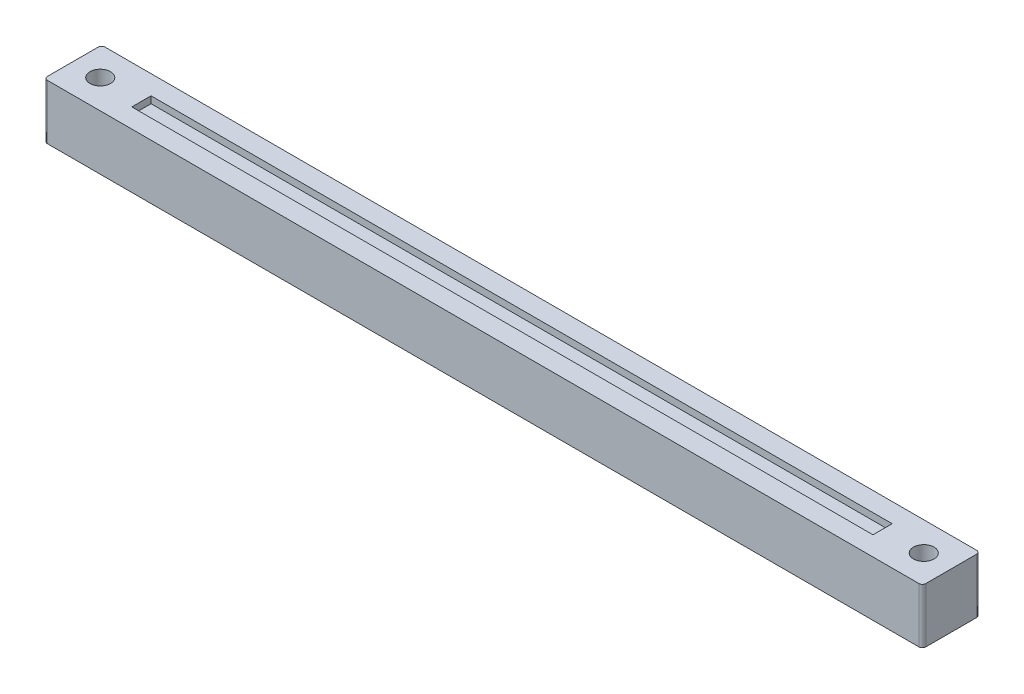
ISO-10303-21;
HEADER;
FILE_DESCRIPTION(('STEP AP214'),'2;1');
FILE_NAME('part.step','',(''),(''),'','','');
FILE_SCHEMA(('AUTOMOTIVE_DESIGN { 1 0 10303 214 1 1 1 1 }'));
ENDSEC;
DATA;
#1=APPLICATION_CONTEXT('core data for automotive mechanical design processes');
#2=APPLICATION_PROTOCOL_DEFINITION('international standard','automotive_design',2000,#1);
#3=PRODUCT_CONTEXT('',#1,'mechanical');
#4=PRODUCT('Part','Part','',(#3));
#5=PRODUCT_RELATED_PRODUCT_CATEGORY('part','',(#4));
#6=PRODUCT_DEFINITION_FORMATION('','',#4);
#7=PRODUCT_DEFINITION_CONTEXT('part definition',#1,'design');
#8=PRODUCT_DEFINITION('design','',#6,#7);
#9=PRODUCT_DEFINITION_SHAPE('','',#8);
#10=(LENGTH_UNIT() NAMED_UNIT(*) SI_UNIT(.MILLI.,.METRE.));
#11=(NAMED_UNIT(*) PLANE_ANGLE_UNIT() SI_UNIT($,.RADIAN.));
#12=(NAMED_UNIT(*) SI_UNIT($,.STERADIAN.) SOLID_ANGLE_UNIT());
#13=UNCERTAINTY_MEASURE_WITH_UNIT(LENGTH_MEASURE(1.E-05),#10,'distance_accuracy_value','');
#14=(GEOMETRIC_REPRESENTATION_CONTEXT(3) GLOBAL_UNCERTAINTY_ASSIGNED_CONTEXT((#13)) GLOBAL_UNIT_ASSIGNED_CONTEXT((#10,
#11,#12)) REPRESENTATION_CONTEXT('',''));
#15=CARTESIAN_POINT('',(0.,0.,0.));
#16=DIRECTION('',(0.,0.,1.));
#17=DIRECTION('',(1.,0.,0.));
#18=AXIS2_PLACEMENT_3D('',#15,#16,#17);
#19=CARTESIAN_POINT('',(63.9999999999999,8.,4.2));
#20=DIRECTION('',(-1.,0.,0.));
#21=DIRECTION('',(0.,0.,1.));
#22=AXIS2_PLACEMENT_3D('',#19,#20,#21);
#23=PLANE('',#22);
#24=DIRECTION('',(0.,0.,-1.));
#25=VECTOR('',#24,1.);
#26=CARTESIAN_POINT('',(63.9999999999999,8.,4.2));
#27=LINE('',#26,#25);
#28=CARTESIAN_POINT('',(63.9999999999999,8.,3.7));
#29=VERTEX_POINT('',#28);
#30=CARTESIAN_POINT('',(63.9999999999999,8.,-3.7));
#31=VERTEX_POINT('',#30);
#32=EDGE_CURVE('E178',#29,#31,#27,.T.);
#33=ORIENTED_EDGE('',*,*,#32,.F.);
#34=DIRECTION('',(0.,-1.,0.));
#35=VECTOR('',#34,1.);
#36=CARTESIAN_POINT('',(63.9999999999999,8.,3.7));
#37=LINE('',#36,#35);
#38=CARTESIAN_POINT('',(63.9999999999999,0.,3.7));
#39=VERTEX_POINT('',#38);
#40=EDGE_CURVE('E200',#29,#39,#37,.T.);
#41=ORIENTED_EDGE('',*,*,#40,.T.);
#42=DIRECTION('',(0.,0.,-1.));
#43=VECTOR('',#42,1.);
#44=CARTESIAN_POINT('',(63.9999999999999,0.,4.2));
#45=LINE('',#44,#43);
#46=CARTESIAN_POINT('',(63.9999999999999,0.,-3.7));
#47=VERTEX_POINT('',#46);
#48=EDGE_CURVE('E175',#39,#47,#45,.T.);
#49=ORIENTED_EDGE('',*,*,#48,.T.);
#50=DIRECTION('',(0.,-1.,0.));
#51=VECTOR('',#50,1.);
#52=CARTESIAN_POINT('',(63.9999999999999,8.,-3.7));
#53=LINE('',#52,#51);
#54=EDGE_CURVE('E189',#47,#31,#53,.F.);
#55=ORIENTED_EDGE('',*,*,#54,.T.);
#56=EDGE_LOOP('',(#33,#41,#49,#55));
#57=FACE_BOUND('',#56,.T.);
#58=ADVANCED_FACE('F33',(#57),#23,.F.);
#59=CARTESIAN_POINT('',(-64.0000000000001,8.,-4.2));
#60=DIRECTION('',(0.,0.,1.));
#61=DIRECTION('',(1.,0.,0.));
#62=AXIS2_PLACEMENT_3D('',#59,#60,#61);
#63=PLANE('',#62);
#64=DIRECTION('',(-1.,0.,0.));
#65=VECTOR('',#64,1.);
#66=CARTESIAN_POINT('',(-64.0000000000001,8.,-4.2));
#67=LINE('',#66,#65);
#68=CARTESIAN_POINT('',(63.4999999999999,8.,-4.2));
#69=VERTEX_POINT('',#68);
#70=CARTESIAN_POINT('',(-63.5000000000001,8.,-4.2));
#71=VERTEX_POINT('',#70);
#72=EDGE_CURVE('E181',#69,#71,#67,.T.);
#73=ORIENTED_EDGE('',*,*,#72,.F.);
#74=DIRECTION('',(0.,-1.,0.));
#75=VECTOR('',#74,1.);
#76=CARTESIAN_POINT('',(63.4999999999999,8.,-4.2));
#77=LINE('',#76,#75);
#78=CARTESIAN_POINT('',(63.4999999999999,0.,-4.2));
#79=VERTEX_POINT('',#78);
#80=EDGE_CURVE('E225',#69,#79,#77,.T.);
#81=ORIENTED_EDGE('',*,*,#80,.T.);
#82=DIRECTION('',(-1.,0.,0.));
#83=VECTOR('',#82,1.);
#84=CARTESIAN_POINT('',(-64.0000000000001,0.,-4.2));
#85=LINE('',#84,#83);
#86=CARTESIAN_POINT('',(-63.5000000000001,0.,-4.2));
#87=VERTEX_POINT('',#86);
#88=EDGE_CURVE('E192',#79,#87,#85,.T.);
#89=ORIENTED_EDGE('',*,*,#88,.T.);
#90=DIRECTION('',(0.,-1.,0.));
#91=VECTOR('',#90,1.);
#92=CARTESIAN_POINT('',(-63.5000000000001,8.,-4.2));
#93=LINE('',#92,#91);
#94=EDGE_CURVE('E223',#87,#71,#93,.F.);
#95=ORIENTED_EDGE('',*,*,#94,.T.);
#96=EDGE_LOOP('',(#73,#81,#89,#95));
#97=FACE_BOUND('',#96,.T.);
#98=ADVANCED_FACE('F231',(#97),#63,.F.);
#99=CARTESIAN_POINT('',(-64.0000000000001,8.,4.2));
#100=DIRECTION('',(1.,0.,0.));
#101=DIRECTION('',(0.,0.,-1.));
#102=AXIS2_PLACEMENT_3D('',#99,#100,#101);
#103=PLANE('',#102);
#104=DIRECTION('',(0.,0.,1.));
#105=VECTOR('',#104,1.);
#106=CARTESIAN_POINT('',(-64.0000000000001,8.,4.2));
#107=LINE('',#106,#105);
#108=CARTESIAN_POINT('',(-64.0000000000001,8.,-3.7));
#109=VERTEX_POINT('',#108);
#110=CARTESIAN_POINT('',(-64.0000000000001,8.,3.7));
#111=VERTEX_POINT('',#110);
#112=EDGE_CURVE('E184',#109,#111,#107,.T.);
#113=ORIENTED_EDGE('',*,*,#112,.F.);
#114=DIRECTION('',(0.,-1.,0.));
#115=VECTOR('',#114,1.);
#116=CARTESIAN_POINT('',(-64.0000000000001,8.,-3.7));
#117=LINE('',#116,#115);
#118=CARTESIAN_POINT('',(-64.0000000000001,0.,-3.7));
#119=VERTEX_POINT('',#118);
#120=EDGE_CURVE('E11',#109,#119,#117,.T.);
#121=ORIENTED_EDGE('',*,*,#120,.T.);
#122=DIRECTION('',(0.,0.,1.));
#123=VECTOR('',#122,1.);
#124=CARTESIAN_POINT('',(-64.0000000000001,0.,4.2));
#125=LINE('',#124,#123);
#126=CARTESIAN_POINT('',(-64.0000000000001,0.,3.7));
#127=VERTEX_POINT('',#126);
#128=EDGE_CURVE('E195',#119,#127,#125,.T.);
#129=ORIENTED_EDGE('',*,*,#128,.T.);
#130=DIRECTION('',(0.,-1.,0.));
#131=VECTOR('',#130,1.);
#132=CARTESIAN_POINT('',(-64.0000000000001,8.,3.7));
#133=LINE('',#132,#131);
#134=EDGE_CURVE('E41',#127,#111,#133,.F.);
#135=ORIENTED_EDGE('',*,*,#134,.T.);
#136=EDGE_LOOP('',(#113,#121,#129,#135));
#137=FACE_BOUND('',#136,.T.);
#138=ADVANCED_FACE('F242',(#137),#103,.F.);
#139=CARTESIAN_POINT('',(-64.0000000000001,8.,4.2));
#140=DIRECTION('',(0.,0.,-1.));
#141=DIRECTION('',(-1.,0.,0.));
#142=AXIS2_PLACEMENT_3D('',#139,#140,#141);
#143=PLANE('',#142);
#144=DIRECTION('',(1.,0.,0.));
#145=VECTOR('',#144,1.);
#146=CARTESIAN_POINT('',(-64.0000000000001,0.,4.2));
#147=LINE('',#146,#145);
#148=CARTESIAN_POINT('',(-63.5000000000001,0.,4.2));
#149=VERTEX_POINT('',#148);
#150=CARTESIAN_POINT('',(63.4999999999999,0.,4.2));
#151=VERTEX_POINT('',#150);
#152=EDGE_CURVE('E182',#149,#151,#147,.T.);
#153=ORIENTED_EDGE('',*,*,#152,.T.);
#154=DIRECTION('',(0.,-1.,0.));
#155=VECTOR('',#154,1.);
#156=CARTESIAN_POINT('',(63.4999999999999,8.,4.2));
#157=LINE('',#156,#155);
#158=CARTESIAN_POINT('',(63.4999999999999,8.,4.2));
#159=VERTEX_POINT('',#158);
#160=EDGE_CURVE('E214',#151,#159,#157,.F.);
#161=ORIENTED_EDGE('',*,*,#160,.T.);
#162=DIRECTION('',(1.,0.,0.));
#163=VECTOR('',#162,1.);
#164=CARTESIAN_POINT('',(-64.0000000000001,8.,4.2));
#165=LINE('',#164,#163);
#166=CARTESIAN_POINT('',(-63.5000000000001,8.,4.2));
#167=VERTEX_POINT('',#166);
#168=EDGE_CURVE('E186',#167,#159,#165,.T.);
#169=ORIENTED_EDGE('',*,*,#168,.F.);
#170=DIRECTION('',(0.,-1.,0.));
#171=VECTOR('',#170,1.);
#172=CARTESIAN_POINT('',(-63.5000000000001,8.,4.2));
#173=LINE('',#172,#171);
#174=EDGE_CURVE('E211',#167,#149,#173,.T.);
#175=ORIENTED_EDGE('',*,*,#174,.T.);
#176=EDGE_LOOP('',(#153,#161,#169,#175));
#177=FACE_BOUND('',#176,.T.);
#178=ADVANCED_FACE('F250',(#177),#143,.F.);
#179=CARTESIAN_POINT('',(0.,8.,0.));
#180=DIRECTION('',(0.,-1.,0.));
#181=DIRECTION('',(0.,0.,-1.));
#182=AXIS2_PLACEMENT_3D('',#179,#180,#181);
#183=PLANE('',#182);
#184=DIRECTION('',(-1.,0.,0.));
#185=VECTOR('',#184,1.);
#186=CARTESIAN_POINT('',(-54.,8.,-1.4));
#187=LINE('',#186,#185);
#188=CARTESIAN_POINT('',(54.,8.,-1.4));
#189=VERTEX_POINT('',#188);
#190=CARTESIAN_POINT('',(-54.,8.,-1.4));
#191=VERTEX_POINT('',#190);
#192=EDGE_CURVE('E156',#189,#191,#187,.T.);
#193=ORIENTED_EDGE('',*,*,#192,.F.);
#194=DIRECTION('',(0.,0.,-1.));
#195=VECTOR('',#194,1.);
#196=CARTESIAN_POINT('',(54.,8.,1.4));
#197=LINE('',#196,#195);
#198=CARTESIAN_POINT('',(54.,8.,1.4));
#199=VERTEX_POINT('',#198);
#200=EDGE_CURVE('E130',#199,#189,#197,.T.);
#201=ORIENTED_EDGE('',*,*,#200,.F.);
#202=DIRECTION('',(1.,0.,0.));
#203=VECTOR('',#202,1.);
#204=CARTESIAN_POINT('',(-54.,8.,1.4));
#205=LINE('',#204,#203);
#206=CARTESIAN_POINT('',(-54.,8.,1.4));
#207=VERTEX_POINT('',#206);
#208=EDGE_CURVE('E147',#207,#199,#205,.T.);
#209=ORIENTED_EDGE('',*,*,#208,.F.);
#210=DIRECTION('',(0.,0.,1.));
#211=VECTOR('',#210,1.);
#212=CARTESIAN_POINT('',(-54.,8.,1.4));
#213=LINE('',#212,#211);
#214=EDGE_CURVE('E150',#191,#207,#213,.T.);
#215=ORIENTED_EDGE('',*,*,#214,.F.);
#216=EDGE_LOOP('',(#193,#201,#209,#215));
#217=FACE_BOUND('',#216,.T.);
#218=CARTESIAN_POINT('',(60.,8.,0.));
#219=DIRECTION('',(0.,1.,0.));
#220=DIRECTION('',(0.,0.,-1.));
#221=AXIS2_PLACEMENT_3D('',#218,#219,#220);
#222=CIRCLE('',#221,1.5);
#223=CARTESIAN_POINT('',(60.,8.,-1.5));
#224=VERTEX_POINT('',#223);
#225=EDGE_CURVE('E162',#224,#224,#222,.T.);
#226=ORIENTED_EDGE('',*,*,#225,.F.);
#227=EDGE_LOOP('',(#226));
#228=FACE_BOUND('',#227,.T.);
#229=CARTESIAN_POINT('',(-60.,8.,0.));
#230=DIRECTION('',(0.,1.,0.));
#231=DIRECTION('',(0.,0.,1.));
#232=AXIS2_PLACEMENT_3D('',#229,#230,#231);
#233=CIRCLE('',#232,1.5);
#234=CARTESIAN_POINT('',(-60.,8.,1.5));
#235=VERTEX_POINT('',#234);
#236=EDGE_CURVE('E169',#235,#235,#233,.T.);
#237=ORIENTED_EDGE('',*,*,#236,.F.);
#238=EDGE_LOOP('',(#237));
#239=FACE_BOUND('',#238,.T.);
#240=ORIENTED_EDGE('',*,*,#168,.T.);
#241=CARTESIAN_POINT('',(63.4999999999999,8.,3.7));
#242=DIRECTION('',(0.,-1.,0.));
#243=DIRECTION('',(0.,0.,-1.));
#244=AXIS2_PLACEMENT_3D('',#241,#242,#243);
#245=CIRCLE('',#244,0.5);
#246=EDGE_CURVE('E221',#159,#29,#245,.F.);
#247=ORIENTED_EDGE('',*,*,#246,.T.);
#248=ORIENTED_EDGE('',*,*,#32,.T.);
#249=CARTESIAN_POINT('',(63.4999999999999,8.,-3.7));
#250=DIRECTION('',(0.,-1.,0.));
#251=DIRECTION('',(0.,0.,-1.));
#252=AXIS2_PLACEMENT_3D('',#249,#250,#251);
#253=CIRCLE('',#252,0.5);
#254=EDGE_CURVE('E219',#31,#69,#253,.F.);
#255=ORIENTED_EDGE('',*,*,#254,.T.);
#256=ORIENTED_EDGE('',*,*,#72,.T.);
#257=CARTESIAN_POINT('',(-63.5000000000001,8.,-3.7));
#258=DIRECTION('',(0.,-1.,0.));
#259=DIRECTION('',(0.,0.,-1.));
#260=AXIS2_PLACEMENT_3D('',#257,#258,#259);
#261=CIRCLE('',#260,0.5);
#262=EDGE_CURVE('E54',#71,#109,#261,.F.);
#263=ORIENTED_EDGE('',*,*,#262,.T.);
#264=ORIENTED_EDGE('',*,*,#112,.T.);
#265=CARTESIAN_POINT('',(-63.5000000000001,8.,3.7));
#266=DIRECTION('',(0.,-1.,0.));
#267=DIRECTION('',(0.,0.,-1.));
#268=AXIS2_PLACEMENT_3D('',#265,#266,#267);
#269=CIRCLE('',#268,0.5);
#270=EDGE_CURVE('E216',#111,#167,#269,.F.);
#271=ORIENTED_EDGE('',*,*,#270,.T.);
#272=EDGE_LOOP('',(#240,#247,#248,#255,#256,#263,#264,#271));
#273=FACE_BOUND('',#272,.T.);
#274=ADVANCED_FACE('F244',(#217,#228,#239,#273),#183,.F.);
#275=CARTESIAN_POINT('',(0.,0.,0.));
#276=DIRECTION('',(0.,-1.,0.));
#277=DIRECTION('',(0.,0.,-1.));
#278=AXIS2_PLACEMENT_3D('',#275,#276,#277);
#279=PLANE('',#278);
#280=CARTESIAN_POINT('',(60.,0.,0.));
#281=DIRECTION('',(0.,1.,0.));
#282=DIRECTION('',(0.,0.,-1.));
#283=AXIS2_PLACEMENT_3D('',#280,#281,#282);
#284=CIRCLE('',#283,1.5);
#285=CARTESIAN_POINT('',(60.,0.,-1.5));
#286=VERTEX_POINT('',#285);
#287=EDGE_CURVE('E166',#286,#286,#284,.T.);
#288=ORIENTED_EDGE('',*,*,#287,.T.);
#289=EDGE_LOOP('',(#288));
#290=FACE_BOUND('',#289,.T.);
#291=CARTESIAN_POINT('',(-60.,0.,0.));
#292=DIRECTION('',(0.,1.,0.));
#293=DIRECTION('',(0.,0.,1.));
#294=AXIS2_PLACEMENT_3D('',#291,#292,#293);
#295=CIRCLE('',#294,1.5);
#296=CARTESIAN_POINT('',(-60.,0.,1.5));
#297=VERTEX_POINT('',#296);
#298=EDGE_CURVE('E172',#297,#297,#295,.T.);
#299=ORIENTED_EDGE('',*,*,#298,.T.);
#300=EDGE_LOOP('',(#299));
#301=FACE_BOUND('',#300,.T.);
#302=ORIENTED_EDGE('',*,*,#48,.F.);
#303=CARTESIAN_POINT('',(63.4999999999999,0.,3.7));
#304=DIRECTION('',(0.,-1.,0.));
#305=DIRECTION('',(0.,0.,-1.));
#306=AXIS2_PLACEMENT_3D('',#303,#304,#305);
#307=CIRCLE('',#306,0.5);
#308=EDGE_CURVE('E209',#39,#151,#307,.T.);
#309=ORIENTED_EDGE('',*,*,#308,.T.);
#310=ORIENTED_EDGE('',*,*,#152,.F.);
#311=CARTESIAN_POINT('',(-63.5000000000001,0.,3.7));
#312=DIRECTION('',(0.,-1.,0.));
#313=DIRECTION('',(0.,0.,-1.));
#314=AXIS2_PLACEMENT_3D('',#311,#312,#313);
#315=CIRCLE('',#314,0.5);
#316=EDGE_CURVE('E203',#149,#127,#315,.T.);
#317=ORIENTED_EDGE('',*,*,#316,.T.);
#318=ORIENTED_EDGE('',*,*,#128,.F.);
#319=CARTESIAN_POINT('',(-63.5000000000001,0.,-3.7));
#320=DIRECTION('',(0.,-1.,0.));
#321=DIRECTION('',(0.,0.,-1.));
#322=AXIS2_PLACEMENT_3D('',#319,#320,#321);
#323=CIRCLE('',#322,0.5);
#324=EDGE_CURVE('E205',#119,#87,#323,.T.);
#325=ORIENTED_EDGE('',*,*,#324,.T.);
#326=ORIENTED_EDGE('',*,*,#88,.F.);
#327=CARTESIAN_POINT('',(63.4999999999999,0.,-3.7));
#328=DIRECTION('',(0.,-1.,0.));
#329=DIRECTION('',(0.,0.,-1.));
#330=AXIS2_PLACEMENT_3D('',#327,#328,#329);
#331=CIRCLE('',#330,0.5);
#332=EDGE_CURVE('E207',#79,#47,#331,.T.);
#333=ORIENTED_EDGE('',*,*,#332,.T.);
#334=EDGE_LOOP('',(#302,#309,#310,#317,#318,#325,#326,#333));
#335=FACE_BOUND('',#334,.T.);
#336=ADVANCED_FACE('F237',(#290,#301,#335),#279,.T.);
#337=CARTESIAN_POINT('',(-60.,0.,0.));
#338=DIRECTION('',(0.,1.,0.));
#339=DIRECTION('',(0.,0.,1.));
#340=AXIS2_PLACEMENT_3D('',#337,#338,#339);
#341=CYLINDRICAL_SURFACE('',#340,1.5);
#342=ORIENTED_EDGE('',*,*,#298,.F.);
#343=EDGE_LOOP('',(#342));
#344=FACE_BOUND('',#343,.T.);
#345=ORIENTED_EDGE('',*,*,#236,.T.);
#346=EDGE_LOOP('',(#345));
#347=FACE_BOUND('',#346,.T.);
#348=ADVANCED_FACE('F281',(#344,#347),#341,.F.);
#349=CARTESIAN_POINT('',(60.,0.,0.));
#350=DIRECTION('',(0.,1.,0.));
#351=DIRECTION('',(0.,0.,1.));
#352=AXIS2_PLACEMENT_3D('',#349,#350,#351);
#353=CYLINDRICAL_SURFACE('',#352,1.5);
#354=ORIENTED_EDGE('',*,*,#287,.F.);
#355=EDGE_LOOP('',(#354));
#356=FACE_BOUND('',#355,.T.);
#357=ORIENTED_EDGE('',*,*,#225,.T.);
#358=EDGE_LOOP('',(#357));
#359=FACE_BOUND('',#358,.T.);
#360=ADVANCED_FACE('F288',(#356,#359),#353,.F.);
#361=CARTESIAN_POINT('',(54.,7.,1.4));
#362=DIRECTION('',(1.,0.,0.));
#363=DIRECTION('',(0.,0.,-1.));
#364=AXIS2_PLACEMENT_3D('',#361,#362,#363);
#365=PLANE('',#364);
#366=ORIENTED_EDGE('',*,*,#200,.T.);
#367=DIRECTION('',(0.,1.,0.));
#368=VECTOR('',#367,1.);
#369=CARTESIAN_POINT('',(54.,7.,-1.4));
#370=LINE('',#369,#368);
#371=CARTESIAN_POINT('',(54.,7.,-1.4));
#372=VERTEX_POINT('',#371);
#373=EDGE_CURVE('E123',#372,#189,#370,.T.);
#374=ORIENTED_EDGE('',*,*,#373,.F.);
#375=DIRECTION('',(0.,0.,-1.));
#376=VECTOR('',#375,1.);
#377=CARTESIAN_POINT('',(54.,7.,1.4));
#378=LINE('',#377,#376);
#379=CARTESIAN_POINT('',(54.,7.,1.4));
#380=VERTEX_POINT('',#379);
#381=EDGE_CURVE('E127',#380,#372,#378,.T.);
#382=ORIENTED_EDGE('',*,*,#381,.F.);
#383=DIRECTION('',(0.,1.,0.));
#384=VECTOR('',#383,1.);
#385=CARTESIAN_POINT('',(54.,7.,1.4));
#386=LINE('',#385,#384);
#387=EDGE_CURVE('E160',#380,#199,#386,.T.);
#388=ORIENTED_EDGE('',*,*,#387,.T.);
#389=EDGE_LOOP('',(#366,#374,#382,#388));
#390=FACE_BOUND('',#389,.T.);
#391=ADVANCED_FACE('F125',(#390),#365,.F.);
#392=CARTESIAN_POINT('',(-54.,7.,1.4));
#393=DIRECTION('',(0.,0.,1.));
#394=DIRECTION('',(1.,0.,0.));
#395=AXIS2_PLACEMENT_3D('',#392,#393,#394);
#396=PLANE('',#395);
#397=ORIENTED_EDGE('',*,*,#208,.T.);
#398=ORIENTED_EDGE('',*,*,#387,.F.);
#399=DIRECTION('',(1.,0.,0.));
#400=VECTOR('',#399,1.);
#401=CARTESIAN_POINT('',(-54.,7.,1.4));
#402=LINE('',#401,#400);
#403=CARTESIAN_POINT('',(-54.,7.,1.4));
#404=VERTEX_POINT('',#403);
#405=EDGE_CURVE('E135',#404,#380,#402,.T.);
#406=ORIENTED_EDGE('',*,*,#405,.F.);
#407=DIRECTION('',(0.,1.,0.));
#408=VECTOR('',#407,1.);
#409=CARTESIAN_POINT('',(-54.,7.,1.4));
#410=LINE('',#409,#408);
#411=EDGE_CURVE('E163',#404,#207,#410,.T.);
#412=ORIENTED_EDGE('',*,*,#411,.T.);
#413=EDGE_LOOP('',(#397,#398,#406,#412));
#414=FACE_BOUND('',#413,.T.);
#415=ADVANCED_FACE('F295',(#414),#396,.F.);
#416=CARTESIAN_POINT('',(-54.,7.,1.4));
#417=DIRECTION('',(-1.,0.,0.));
#418=DIRECTION('',(0.,0.,1.));
#419=AXIS2_PLACEMENT_3D('',#416,#417,#418);
#420=PLANE('',#419);
#421=ORIENTED_EDGE('',*,*,#214,.T.);
#422=ORIENTED_EDGE('',*,*,#411,.F.);
#423=DIRECTION('',(0.,0.,1.));
#424=VECTOR('',#423,1.);
#425=CARTESIAN_POINT('',(-54.,7.,1.4));
#426=LINE('',#425,#424);
#427=CARTESIAN_POINT('',(-54.,7.,-1.4));
#428=VERTEX_POINT('',#427);
#429=EDGE_CURVE('E143',#428,#404,#426,.T.);
#430=ORIENTED_EDGE('',*,*,#429,.F.);
#431=DIRECTION('',(0.,1.,0.));
#432=VECTOR('',#431,1.);
#433=CARTESIAN_POINT('',(-54.,7.,-1.4));
#434=LINE('',#433,#432);
#435=EDGE_CURVE('E134',#428,#191,#434,.T.);
#436=ORIENTED_EDGE('',*,*,#435,.T.);
#437=EDGE_LOOP('',(#421,#422,#430,#436));
#438=FACE_BOUND('',#437,.T.);
#439=ADVANCED_FACE('F298',(#438),#420,.F.);
#440=CARTESIAN_POINT('',(-54.,7.,-1.4));
#441=DIRECTION('',(0.,0.,-1.));
#442=DIRECTION('',(-1.,0.,0.));
#443=AXIS2_PLACEMENT_3D('',#440,#441,#442);
#444=PLANE('',#443);
#445=ORIENTED_EDGE('',*,*,#192,.T.);
#446=ORIENTED_EDGE('',*,*,#435,.F.);
#447=DIRECTION('',(-1.,0.,0.));
#448=VECTOR('',#447,1.);
#449=CARTESIAN_POINT('',(-54.,7.,-1.4));
#450=LINE('',#449,#448);
#451=EDGE_CURVE('E138',#372,#428,#450,.T.);
#452=ORIENTED_EDGE('',*,*,#451,.F.);
#453=ORIENTED_EDGE('',*,*,#373,.T.);
#454=EDGE_LOOP('',(#445,#446,#452,#453));
#455=FACE_BOUND('',#454,.T.);
#456=ADVANCED_FACE('F139',(#455),#444,.F.);
#457=CARTESIAN_POINT('',(0.,7.,0.));
#458=DIRECTION('',(0.,-1.,0.));
#459=DIRECTION('',(0.,0.,-1.));
#460=AXIS2_PLACEMENT_3D('',#457,#458,#459);
#461=PLANE('',#460);
#462=ORIENTED_EDGE('',*,*,#381,.T.);
#463=ORIENTED_EDGE('',*,*,#451,.T.);
#464=ORIENTED_EDGE('',*,*,#429,.T.);
#465=ORIENTED_EDGE('',*,*,#405,.T.);
#466=EDGE_LOOP('',(#462,#463,#464,#465));
#467=FACE_BOUND('',#466,.T.);
#468=ADVANCED_FACE('F145',(#467),#461,.F.);
#469=CARTESIAN_POINT('',(63.4999999999999,8.,3.7));
#470=DIRECTION('',(0.,-1.,0.));
#471=DIRECTION('',(0.,0.,-1.));
#472=AXIS2_PLACEMENT_3D('',#469,#470,#471);
#473=CYLINDRICAL_SURFACE('',#472,0.5);
#474=ORIENTED_EDGE('',*,*,#246,.F.);
#475=ORIENTED_EDGE('',*,*,#160,.F.);
#476=ORIENTED_EDGE('',*,*,#308,.F.);
#477=ORIENTED_EDGE('',*,*,#40,.F.);
#478=EDGE_LOOP('',(#474,#475,#476,#477));
#479=FACE_BOUND('',#478,.T.);
#480=ADVANCED_FACE('F255',(#479),#473,.T.);
#481=CARTESIAN_POINT('',(63.4999999999999,8.,-3.7));
#482=DIRECTION('',(0.,-1.,0.));
#483=DIRECTION('',(0.,0.,-1.));
#484=AXIS2_PLACEMENT_3D('',#481,#482,#483);
#485=CYLINDRICAL_SURFACE('',#484,0.5);
#486=ORIENTED_EDGE('',*,*,#254,.F.);
#487=ORIENTED_EDGE('',*,*,#54,.F.);
#488=ORIENTED_EDGE('',*,*,#332,.F.);
#489=ORIENTED_EDGE('',*,*,#80,.F.);
#490=EDGE_LOOP('',(#486,#487,#488,#489));
#491=FACE_BOUND('',#490,.T.);
#492=ADVANCED_FACE('F259',(#491),#485,.T.);
#493=CARTESIAN_POINT('',(-63.5000000000001,8.,-3.7));
#494=DIRECTION('',(0.,-1.,0.));
#495=DIRECTION('',(0.,0.,-1.));
#496=AXIS2_PLACEMENT_3D('',#493,#494,#495);
#497=CYLINDRICAL_SURFACE('',#496,0.5);
#498=ORIENTED_EDGE('',*,*,#262,.F.);
#499=ORIENTED_EDGE('',*,*,#94,.F.);
#500=ORIENTED_EDGE('',*,*,#324,.F.);
#501=ORIENTED_EDGE('',*,*,#120,.F.);
#502=EDGE_LOOP('',(#498,#499,#500,#501));
#503=FACE_BOUND('',#502,.T.);
#504=ADVANCED_FACE('F241',(#503),#497,.T.);
#505=CARTESIAN_POINT('',(-63.5000000000001,8.,3.7));
#506=DIRECTION('',(0.,-1.,0.));
#507=DIRECTION('',(0.,0.,-1.));
#508=AXIS2_PLACEMENT_3D('',#505,#506,#507);
#509=CYLINDRICAL_SURFACE('',#508,0.5);
#510=ORIENTED_EDGE('',*,*,#270,.F.);
#511=ORIENTED_EDGE('',*,*,#134,.F.);
#512=ORIENTED_EDGE('',*,*,#316,.F.);
#513=ORIENTED_EDGE('',*,*,#174,.F.);
#514=EDGE_LOOP('',(#510,#511,#512,#513));
#515=FACE_BOUND('',#514,.T.);
#516=ADVANCED_FACE('F35',(#515),#509,.T.);
#517=CLOSED_SHELL('',(#58,#98,#138,#178,#274,#336,#348,#360,#391,#415,#439,#456,#468,#480,#492,
#504,#516));
#518=MANIFOLD_SOLID_BREP('B2',#517);
#519=ADVANCED_BREP_SHAPE_REPRESENTATION('',(#18,#518),#14);
#520=SHAPE_DEFINITION_REPRESENTATION(#9,#519);
ENDSEC;
END-ISO-10303-21;
